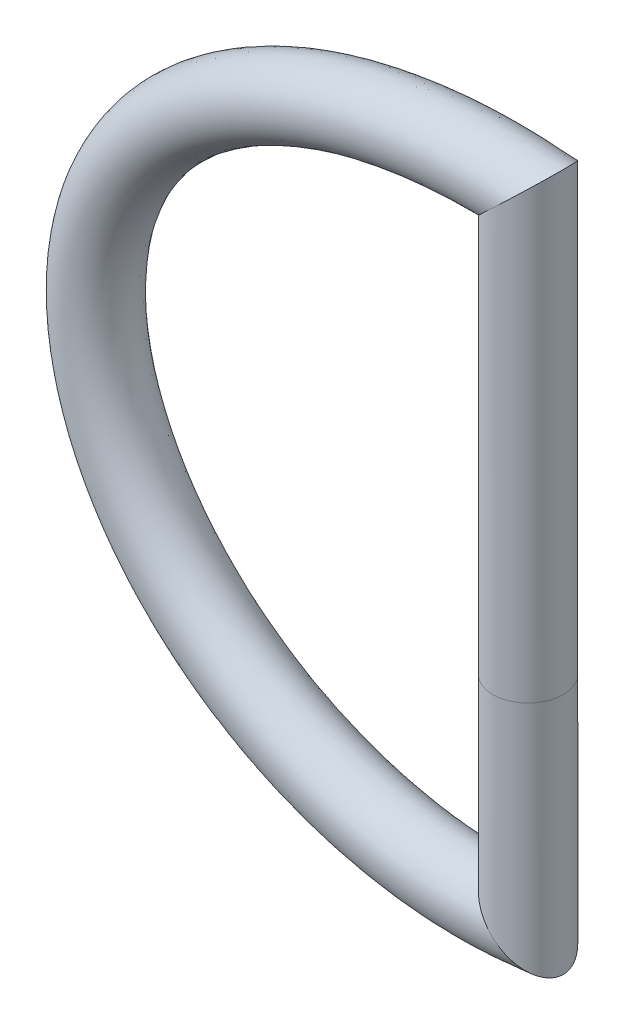
ISO-10303-21;
HEADER;
FILE_DESCRIPTION(('STEP AP214'),'2;1');
FILE_NAME('part.step','',(''),(''),'','','');
FILE_SCHEMA(('AUTOMOTIVE_DESIGN { 1 0 10303 214 1 1 1 1 }'));
ENDSEC;
DATA;
#1=APPLICATION_CONTEXT('core data for automotive mechanical design processes');
#2=APPLICATION_PROTOCOL_DEFINITION('international standard','automotive_design',2000,#1);
#3=PRODUCT_CONTEXT('',#1,'mechanical');
#4=PRODUCT('Part','Part','',(#3));
#5=PRODUCT_RELATED_PRODUCT_CATEGORY('part','',(#4));
#6=PRODUCT_DEFINITION_FORMATION('','',#4);
#7=PRODUCT_DEFINITION_CONTEXT('part definition',#1,'design');
#8=PRODUCT_DEFINITION('design','',#6,#7);
#9=PRODUCT_DEFINITION_SHAPE('','',#8);
#10=(LENGTH_UNIT() NAMED_UNIT(*) SI_UNIT(.MILLI.,.METRE.));
#11=(NAMED_UNIT(*) PLANE_ANGLE_UNIT() SI_UNIT($,.RADIAN.));
#12=(NAMED_UNIT(*) SI_UNIT($,.STERADIAN.) SOLID_ANGLE_UNIT());
#13=UNCERTAINTY_MEASURE_WITH_UNIT(LENGTH_MEASURE(1.E-05),#10,'distance_accuracy_value','');
#14=(GEOMETRIC_REPRESENTATION_CONTEXT(3) GLOBAL_UNCERTAINTY_ASSIGNED_CONTEXT((#13)) GLOBAL_UNIT_ASSIGNED_CONTEXT((#10,
#11,#12)) REPRESENTATION_CONTEXT('',''));
#15=CARTESIAN_POINT('',(0.,0.,0.));
#16=DIRECTION('',(0.,0.,1.));
#17=DIRECTION('',(1.,0.,0.));
#18=AXIS2_PLACEMENT_3D('',#15,#16,#17);
#19=CARTESIAN_POINT('',(0.,0.,0.));
#20=DIRECTION('',(0.,1.,0.));
#21=DIRECTION('',(-1.,0.,0.));
#22=AXIS2_PLACEMENT_3D('',#19,#20,#21);
#23=CYLINDRICAL_SURFACE('',#22,2.5);
#24=CARTESIAN_POINT('',(0.,30.,2.5));
#25=CARTESIAN_POINT('',(-0.00242758933595466,29.997711643465,2.49999999686952));
#26=CARTESIAN_POINT('',(-0.00485516489899741,29.9954231074934,2.49999646103605));
#27=CARTESIAN_POINT('',(-0.196409423319311,29.8148249555442,2.49943868500322));
#28=CARTESIAN_POINT('',(-0.385408715955703,29.6354679999691,2.47744476208934));
#29=CARTESIAN_POINT('',(-0.663935741280289,29.3694003511271,2.41212243911922));
#30=CARTESIAN_POINT('',(-0.756112628902586,29.2810476902248,2.38488054333017));
#31=CARTESIAN_POINT('',(-0.93808848913137,29.1060553229675,2.31933911333307));
#32=CARTESIAN_POINT('',(-1.02788859944775,29.0194148022726,2.28104497805212));
#33=CARTESIAN_POINT('',(-1.24690415816406,28.8074288185577,2.17177219773728));
#34=CARTESIAN_POINT('',(-1.37426751850749,28.6835444220875,2.09393515154554));
#35=CARTESIAN_POINT('',(-1.55707715578674,28.5049401792369,1.95736552682304));
#36=CARTESIAN_POINT('',(-1.61660498614624,28.44664483076,1.90857824252122));
#37=CARTESIAN_POINT('',(-1.73239940853148,28.3330055551281,1.80412556543504));
#38=CARTESIAN_POINT('',(-1.78866672633009,28.2776609713694,1.74846171204557));
#39=CARTESIAN_POINT('',(-1.88259089159773,28.1850913701641,1.64599456905797));
#40=CARTESIAN_POINT('',(-1.92118480021617,28.1469945758922,1.60083133088288));
#41=CARTESIAN_POINT('',(-1.99587040398149,28.0731681772815,1.50668834375601));
#42=CARTESIAN_POINT('',(-2.03196313708981,28.0374375912678,1.45771019609233));
#43=CARTESIAN_POINT('',(-2.10121463224693,27.9687922937819,1.35597804873957));
#44=CARTESIAN_POINT('',(-2.13437755514266,27.9358735912163,1.30322960274689));
#45=CARTESIAN_POINT('',(-2.19740915338584,27.8732330676922,1.19389352681859));
#46=CARTESIAN_POINT('',(-2.22727376255227,27.8435151938274,1.13730129396471));
#47=CARTESIAN_POINT('',(-2.29975950072076,27.7713113233539,0.985771517524161));
#48=CARTESIAN_POINT('',(-2.33944666997743,27.7317008335447,0.887991637828371));
#49=CARTESIAN_POINT('',(-2.40682934743233,27.6643730940401,0.68454266266918));
#50=CARTESIAN_POINT('',(-2.43454321943051,27.6366376318548,0.578885942119706));
#51=CARTESIAN_POINT('',(-2.46576483189486,27.6053734172184,0.416066086068953));
#52=CARTESIAN_POINT('',(-2.4744618373496,27.5966604176581,0.360824831832913));
#53=CARTESIAN_POINT('',(-2.48815561986475,27.582938653416,0.249443945376068));
#54=CARTESIAN_POINT('',(-2.49315431044528,27.577927973144,0.193304793113788));
#55=CARTESIAN_POINT('',(-2.4993369761634,27.5717302109828,0.0806126274247317));
#56=CARTESIAN_POINT('',(-2.50052147494728,27.570542604228,0.0240596718771495));
#57=CARTESIAN_POINT('',(-2.49905762480746,27.5720101180884,-0.0889351343286188));
#58=CARTESIAN_POINT('',(-2.49640916853065,27.5746653463335,-0.145376981830564));
#59=CARTESIAN_POINT('',(-2.48378225921788,27.5873218970721,-0.301371719121013));
#60=CARTESIAN_POINT('',(-2.46970495644719,27.6014304927627,-0.400313065459552));
#61=CARTESIAN_POINT('',(-2.43050917060006,27.6406738229563,-0.593619286574534));
#62=CARTESIAN_POINT('',(-2.40538872757497,27.6658105147363,-0.687983345666535));
#63=CARTESIAN_POINT('',(-2.34413764200287,27.7270156275789,-0.874712940321567));
#64=CARTESIAN_POINT('',(-2.30754222613443,27.7635450721826,-0.966772582173828));
#65=CARTESIAN_POINT('',(-2.22563357530281,27.8451594664577,-1.14280490540782));
#66=CARTESIAN_POINT('',(-2.18031565633525,27.8902490127451,-1.22677320519887));
#67=CARTESIAN_POINT('',(-2.05543394180122,28.0142440877396,-1.43050316792796));
#68=CARTESIAN_POINT('',(-1.97083159672466,28.0980198220673,-1.54423415681154));
#69=CARTESIAN_POINT('',(-1.78945010180347,28.2769574012803,-1.7512600345092));
#70=CARTESIAN_POINT('',(-1.69263905889714,28.3721490350317,-1.84449957666896));
#71=CARTESIAN_POINT('',(-1.45353703630593,28.6063080653121,-2.0418677582088));
#72=CARTESIAN_POINT('',(-1.3075229879158,28.7485926809169,-2.13759578881062));
#73=CARTESIAN_POINT('',(-1.08136147993525,28.9677114679808,-2.2556341255255));
#74=CARTESIAN_POINT('',(-1.00474839388429,29.0417340695137,-2.29073125298253));
#75=CARTESIAN_POINT('',(-0.849601480322741,29.1912155801555,-2.35269275837019));
#76=CARTESIAN_POINT('',(-0.771066974752098,29.2666749941636,-2.37955418335564));
#77=CARTESIAN_POINT('',(-0.467820585401646,29.5571933274376,-2.46686393984059));
#78=CARTESIAN_POINT('',(-0.237520827111306,29.7760648107624,-2.49931892027577));
#79=CARTESIAN_POINT('',(-0.00485513694029879,29.995423135352,-2.49999646169475));
#80=CARTESIAN_POINT('',(-0.00242756126195913,29.9977116714452,-2.49999999748008));
#81=CARTESIAN_POINT('',(0.,29.9999999999962,-2.5));
#82=B_SPLINE_CURVE_WITH_KNOTS('',3,(#24,#25,#26,#27,#28,#29,#30,#31,#32,#33,#34,#35,#36,#37,#38,
#39,#40,#41,#42,#43,#44,#45,#46,#47,#48,#49,#50,#51,#52,#53,#54,#55,#56,#57,#58,#59,#60,#61,#62,
#63,#64,#65,#66,#67,#68,#69,#70,#71,#72,#73,#74,#75,#76,#77,#78,#79,#80,#81),.UNSPECIFIED.,.F.,
.F.,(4,2,2,2,2,2,2,2,2,2,2,2,2,2,2,2,2,2,2,2,2,2,2,2,2,2,2,2,4),(0.,0.010008725858251,
0.789771765318684,1.18108021022694,1.57219782681062,2.15173089651298,2.44112016897403,
2.73044477548927,2.94200076724646,3.15346843313571,3.36463078074316,3.57605061123407,
3.9128117598213,4.24905455828365,4.4186317149882,4.58812107044495,4.75758715589738,
4.92705798783435,5.22833385558132,5.5296632157007,5.84525217694307,6.16101108541662,
6.65219014849806,7.14467999422195,7.81652576527576,8.15274936400428,8.48909337649053,
9.43834641772534,9.44835514358359),.UNSPECIFIED.);
#83=CARTESIAN_POINT('',(0.,29.9999999999962,-2.5));
#84=VERTEX_POINT('',#83);
#85=CARTESIAN_POINT('',(0.,30.,2.5));
#86=VERTEX_POINT('',#85);
#87=EDGE_CURVE('E11',#84,#86,#82,.F.);
#88=ORIENTED_EDGE('',*,*,#87,.F.);
#89=CARTESIAN_POINT('',(0.,30.,2.5));
#90=CARTESIAN_POINT('',(0.00242761921564784,30.0022883858164,2.49999999684379));
#91=CARTESIAN_POINT('',(0.00485529019420946,30.0045768201181,2.49999646096794));
#92=CARTESIAN_POINT('',(0.160398661104378,30.1511991348287,2.49954352397039));
#93=CARTESIAN_POINT('',(0.313694065161512,30.2957012065821,2.48504188368759));
#94=CARTESIAN_POINT('',(0.617683515615141,30.5822535008172,2.42744588777627));
#95=CARTESIAN_POINT('',(0.7683710083105,30.7242975461754,2.38428792631449));
#96=CARTESIAN_POINT('',(1.05742842146146,30.996774684717,2.27044137965047));
#97=CARTESIAN_POINT('',(1.19604966908927,31.1274446853955,2.20100018386744));
#98=CARTESIAN_POINT('',(1.39655669983975,31.3164507108953,2.0750541130404));
#99=CARTESIAN_POINT('',(1.46213681224689,31.3782691701147,2.02945788975828));
#100=CARTESIAN_POINT('',(1.59023746767387,31.4990220168626,1.93072029522012));
#101=CARTESIAN_POINT('',(1.65275874998702,31.5579571012785,1.87758075935365));
#102=CARTESIAN_POINT('',(1.75790395774895,31.6570712178818,1.77862818981656));
#103=CARTESIAN_POINT('',(1.80141766366647,31.6980889931824,1.73459347783126));
#104=CARTESIAN_POINT('',(1.88596734377379,31.7777889339423,1.64226775828615));
#105=CARTESIAN_POINT('',(1.92700434905934,31.816472071354,1.5939785428394));
#106=CARTESIAN_POINT('',(2.00612444689691,31.8910538687954,1.49317190522588));
#107=CARTESIAN_POINT('',(2.04421207950288,31.9269568084632,1.44066124589597));
#108=CARTESIAN_POINT('',(2.11705107585133,31.9956177861256,1.33132161205062));
#109=CARTESIAN_POINT('',(2.15179827200517,32.0283718955829,1.27448739768946));
#110=CARTESIAN_POINT('',(2.23686018839291,32.108554690984,1.12160852181932));
#111=CARTESIAN_POINT('',(2.28416312476724,32.1531443479081,1.02232472506126));
#112=CARTESIAN_POINT('',(2.36624591373553,32.2305188975671,0.814437628427292));
#113=CARTESIAN_POINT('',(2.401045059542,32.2633219768626,0.705849009259704));
#114=CARTESIAN_POINT('',(2.44224346249359,32.3021572542105,0.537444220791034));
#115=CARTESIAN_POINT('',(2.45417208247046,32.3134016528277,0.480111239816979));
#116=CARTESIAN_POINT('',(2.47403219972364,32.3321226008847,0.364165113210484));
#117=CARTESIAN_POINT('',(2.48196576421792,32.3396010989676,0.305552646056614));
#118=CARTESIAN_POINT('',(2.49365865820967,32.3506232927575,0.18756154734911));
#119=CARTESIAN_POINT('',(2.49741929971994,32.3541682252207,0.12818316255167));
#120=CARTESIAN_POINT('',(2.50069241601538,32.3572535967405,0.00921871907608236));
#121=CARTESIAN_POINT('',(2.50020487693854,32.3567940227302,-0.0503673402790819));
#122=CARTESIAN_POINT('',(2.49299705370572,32.3499996376501,-0.214043088529186));
#123=CARTESIAN_POINT('',(2.48185583666801,32.3394974768211,-0.317824292237977));
#124=CARTESIAN_POINT('',(2.44722497054909,32.3068530247535,-0.521319557819026));
#125=CARTESIAN_POINT('',(2.42373430250484,32.2847097729993,-0.621033283348722));
#126=CARTESIAN_POINT('',(2.36537085402751,32.2296940309649,-0.815794622600916));
#127=CARTESIAN_POINT('',(2.33032004122373,32.1966537201866,-0.91074061987044));
#128=CARTESIAN_POINT('',(2.25073490620101,32.1216335599779,-1.09274024847685));
#129=CARTESIAN_POINT('',(2.20619604840121,32.079649435126,-1.17979007672261));
#130=CARTESIAN_POINT('',(2.08622856715247,31.9665632453554,-1.38481022164153));
#131=CARTESIAN_POINT('',(2.00620120577661,31.8911262243177,-1.4977151721705));
#132=CARTESIAN_POINT('',(1.83394605045247,31.7287515638457,-1.70435750374983));
#133=CARTESIAN_POINT('',(1.74168951108571,31.6417868278238,-1.79804835682696));
#134=CARTESIAN_POINT('',(1.51092192976973,31.424255987696,-1.99971495872021));
#135=CARTESIAN_POINT('',(1.36838891695756,31.2898986085347,-2.0990456361338));
#136=CARTESIAN_POINT('',(1.14742324031258,31.0816074608506,-2.22273582255323));
#137=CARTESIAN_POINT('',(1.07251506831104,31.0109960054587,-2.25976641143602));
#138=CARTESIAN_POINT('',(0.920818513164784,30.868000677351,-2.3257129788258));
#139=CARTESIAN_POINT('',(0.844029262212978,30.7956159865796,-2.35462513233609));
#140=CARTESIAN_POINT('',(0.518195357245599,30.4884720501117,-2.45957129343063));
#141=CARTESIAN_POINT('',(0.262037442623841,30.2470085180626,-2.49924733679819));
#142=CARTESIAN_POINT('',(0.00485520742948768,30.0045767420379,-2.49999646329127));
#143=CARTESIAN_POINT('',(0.0024275359641753,30.0022883072752,-2.49999999905308));
#144=CARTESIAN_POINT('',(0.,29.9999999999962,-2.5));
#145=B_SPLINE_CURVE_WITH_KNOTS('',3,(#89,#90,#91,#92,#93,#94,#95,#96,#97,#98,#99,#100,#101,#102,
#103,#104,#105,#106,#107,#108,#109,#110,#111,#112,#113,#114,#115,#116,#117,#118,#119,#120,#121,
#122,#123,#124,#125,#126,#127,#128,#129,#130,#131,#132,#133,#134,#135,#136,#137,#138,#139,#140,
#141,#142,#143,#144),.UNSPECIFIED.,.F.,.F.,(4,2,2,2,2,2,2,2,2,2,2,2,2,2,2,2,2,2,2,2,2,2,2,2,2,2,
2,4),(0.,0.0100087258504155,0.641257400136784,1.27391190455173,1.8796910873187,2.18240370717604,
2.48504279882144,2.70765531304371,2.93017450105917,3.15234405329319,3.37478728571056,
3.72935168819262,4.08336662821073,4.2620319731368,4.44060477348727,4.61912141266644,
4.79763863435357,5.11071292849417,5.42381305869947,5.74197972294347,6.06029882342727,
6.53050545769648,7.00183761698316,7.65671490944865,7.98464339550147,8.31272612663922,
9.3629643819335,9.37297310778393),.UNSPECIFIED.);
#146=EDGE_CURVE('E41',#84,#86,#145,.F.);
#147=ORIENTED_EDGE('',*,*,#146,.T.);
#148=EDGE_LOOP('',(#88,#147));
#149=FACE_BOUND('',#148,.T.);
#150=CARTESIAN_POINT('',(0.,0.,0.));
#151=DIRECTION('',(0.,1.,0.));
#152=DIRECTION('',(0.,0.,1.));
#153=AXIS2_PLACEMENT_3D('',#150,#151,#152);
#154=CIRCLE('',#153,2.5);
#155=CARTESIAN_POINT('',(0.,0.,2.5));
#156=VERTEX_POINT('',#155);
#157=EDGE_CURVE('E36',#156,#156,#154,.T.);
#158=ORIENTED_EDGE('',*,*,#157,.T.);
#159=EDGE_LOOP('',(#158));
#160=FACE_BOUND('',#159,.T.);
#161=ADVANCED_FACE('F33',(#149,#160),#23,.T.);
#162=CARTESIAN_POINT('',(0.,-20.0378907282445,0.));
#163=DIRECTION('',(0.,1.,0.));
#164=DIRECTION('',(-1.,0.,0.));
#165=AXIS2_PLACEMENT_3D('',#162,#163,#164);
#166=CYLINDRICAL_SURFACE('',#165,2.5);
#167=ORIENTED_EDGE('',*,*,#157,.F.);
#168=EDGE_LOOP('',(#167));
#169=FACE_BOUND('',#168,.T.);
#170=CARTESIAN_POINT('',(0.,-15.,2.5));
#171=CARTESIAN_POINT('',(-0.00248748517167338,-14.9977667226863,2.49999999894582));
#172=CARTESIAN_POINT('',(-0.00497490988377203,-14.9955332327376,2.49999628643611));
#173=CARTESIAN_POINT('',(-0.164123975182655,-14.8526142146651,2.49952130417221));
#174=CARTESIAN_POINT('',(-0.320514382726782,-14.7111141928376,2.48433249454209));
#175=CARTESIAN_POINT('',(-0.551962858220917,-14.500141942946,2.43957826909047));
#176=CARTESIAN_POINT('',(-0.628707186653392,-14.4299218815481,2.42095188473309));
#177=CARTESIAN_POINT('',(-0.780753496867249,-14.2902911994343,2.3762786269186));
#178=CARTESIAN_POINT('',(-0.856055575514993,-14.2208805244808,2.35023225369136));
#179=CARTESIAN_POINT('',(-1.07450255628537,-14.0187897060722,2.26263895094367));
#180=CARTESIAN_POINT('',(-1.21519955710655,-13.8876787253153,2.19067844318063));
#181=CARTESIAN_POINT('',(-1.41775886916162,-13.6976824171171,2.06067446218404));
#182=CARTESIAN_POINT('',(-1.48382022363326,-13.6355039382633,2.01370390028028));
#183=CARTESIAN_POINT('',(-1.61267754260394,-13.513837281053,1.91207011168897));
#184=CARTESIAN_POINT('',(-1.67546897680681,-13.4543528492693,1.8573965819424));
#185=CARTESIAN_POINT('',(-1.82413323963542,-13.3130954637082,1.71390833552298));
#186=CARTESIAN_POINT('',(-1.90775744091011,-13.2332634921044,1.62076557174162));
#187=CARTESIAN_POINT('',(-2.06312554707501,-13.0843837016757,1.41766964189256));
#188=CARTESIAN_POINT('',(-2.13489683090265,-13.0153110515917,1.30775637762732));
#189=CARTESIAN_POINT('',(-2.24937242003516,-12.9048117793627,1.096190239651));
#190=CARTESIAN_POINT('',(-2.29501737687687,-12.8606233715634,0.997582278958237));
#191=CARTESIAN_POINT('',(-2.37406927878371,-12.7839581871414,0.791168646996713));
#192=CARTESIAN_POINT('',(-2.40748401702938,-12.7514739527444,0.683368886997056));
#193=CARTESIAN_POINT('',(-2.44678675286235,-12.7132259087219,0.51630175281886));
#194=CARTESIAN_POINT('',(-2.45811117896558,-12.7021967616989,0.45944396412312));
#195=CARTESIAN_POINT('',(-2.4768340640973,-12.6839548816816,0.344493505712135));
#196=CARTESIAN_POINT('',(-2.4842344706924,-12.6767402554722,0.286401463499448));
#197=CARTESIAN_POINT('',(-2.4949374923461,-12.6663041405106,0.169500459236129));
#198=CARTESIAN_POINT('',(-2.49824137491865,-12.6630814166159,0.110691724628808));
#199=CARTESIAN_POINT('',(-2.50068486662611,-12.6606979527666,-0.00707497778342958));
#200=CARTESIAN_POINT('',(-2.49982492777688,-12.6615367718993,-0.0660329286952429));
#201=CARTESIAN_POINT('',(-2.49175173409979,-12.6694110817758,-0.227303379562851));
#202=CARTESIAN_POINT('',(-2.48028999962609,-12.6805902580252,-0.329257119471162));
#203=CARTESIAN_POINT('',(-2.44549152459978,-12.7144889858488,-0.529041420804237));
#204=CARTESIAN_POINT('',(-2.42215316741566,-12.7372101084979,-0.626871418946717));
#205=CARTESIAN_POINT('',(-2.36439046273491,-12.7933439175407,-0.818467593592743));
#206=CARTESIAN_POINT('',(-2.32973230547609,-12.8269819907352,-0.912096004861728));
#207=CARTESIAN_POINT('',(-2.25123667773992,-12.9029919795179,-1.0915814130176));
#208=CARTESIAN_POINT('',(-2.20739460079934,-12.9453682778508,-1.17743447888227));
#209=CARTESIAN_POINT('',(-2.08770767506405,-13.0607424254556,-1.3827313571673));
#210=CARTESIAN_POINT('',(-2.00698959496134,-13.1382907471293,-1.49678686563306));
#211=CARTESIAN_POINT('',(-1.83291927689618,-13.3047206797236,-1.70557167826127));
#212=CARTESIAN_POINT('',(-1.73953207688905,-13.3936336120147,-1.80024561548365));
#213=CARTESIAN_POINT('',(-1.57566566443273,-13.5488413841677,-1.94291626400599));
#214=CARTESIAN_POINT('',(-1.50762902217173,-13.6130736696903,-1.99607381979594));
#215=CARTESIAN_POINT('',(-1.36836735063331,-13.7440811830104,-2.09399279082362));
#216=CARTESIAN_POINT('',(-1.29714799024806,-13.810851860177,-2.13876845076803));
#217=CARTESIAN_POINT('',(-1.07934739107169,-14.0142954166406,-2.26114373058253));
#218=CARTESIAN_POINT('',(-0.928701893404173,-14.1540255736248,-2.32672548710775));
#219=CARTESIAN_POINT('',(-0.650009613721068,-14.410549462476,-2.41759564610391));
#220=CARTESIAN_POINT('',(-0.523019594207043,-14.5267332190513,-2.44813246632711));
#221=CARTESIAN_POINT('',(-0.266587747169477,-14.7598783634521,-2.48912591390831));
#222=CARTESIAN_POINT('',(-0.137148391167591,-14.8768388973974,-2.4996017956938));
#223=CARTESIAN_POINT('',(-0.00497493247137268,-14.9955332110568,-2.49999628670298));
#224=CARTESIAN_POINT('',(-0.00248750796109603,-14.9977667008051,-2.49999999925538));
#225=CARTESIAN_POINT('',(0.,-15.0000000000038,-2.5));
#226=B_SPLINE_CURVE_WITH_KNOTS('',3,(#170,#171,#172,#173,#174,#175,#176,#177,#178,#179,#180,
#181,#182,#183,#184,#185,#186,#187,#188,#189,#190,#191,#192,#193,#194,#195,#196,#197,#198,#199,
#200,#201,#202,#203,#204,#205,#206,#207,#208,#209,#210,#211,#212,#213,#214,#215,#216,#217,#218,
#219,#220,#221,#222,#223,#224,#225),.UNSPECIFIED.,.F.,.F.,(4,2,2,2,2,2,2,2,2,2,2,2,2,2,2,2,2,2,
2,2,2,2,2,2,2,2,2,4),(0.,0.0100290448103385,0.641690574934158,0.958515055333558,
1.27531818157965,1.88854906910156,2.19472854401923,2.50132150551582,2.94514419842587,
3.38792691932566,3.73851885801115,4.08888700653298,4.26570570016507,4.44243655292881,
4.61911270937866,4.79576968665986,5.10377658327082,5.41182541662619,5.72668850417033,
6.04170990027443,6.51849029703365,6.9966142601725,7.31904928934308,7.64093127672657,
8.28507032999133,8.80847340488903,9.33137386683,9.34140291164086),.UNSPECIFIED.);
#227=CARTESIAN_POINT('',(0.,-15.0000000000038,-2.5));
#228=VERTEX_POINT('',#227);
#229=CARTESIAN_POINT('',(0.,-15.,2.5));
#230=VERTEX_POINT('',#229);
#231=EDGE_CURVE('E59',#228,#230,#226,.F.);
#232=ORIENTED_EDGE('',*,*,#231,.T.);
#233=CARTESIAN_POINT('',(0.,-15.,2.5));
#234=CARTESIAN_POINT('',(0.00248750067869611,-15.0022332937215,2.49999999610187));
#235=CARTESIAN_POINT('',(0.00497505681845969,-15.0044666367901,2.4999962836381));
#236=CARTESIAN_POINT('',(0.164208362045282,-15.1474272409919,2.49952120097888));
#237=CARTESIAN_POINT('',(0.321145397448877,-15.2883245005056,2.48432568430823));
#238=CARTESIAN_POINT('',(0.632120512891194,-15.567516820784,2.42396162738511));
#239=CARTESIAN_POINT('',(0.786151122939602,-15.7058051761036,2.37872445926047));
#240=CARTESIAN_POINT('',(1.07645744458139,-15.9664416575493,2.26140747919689));
#241=CARTESIAN_POINT('',(1.21321326228286,-16.0892208160931,2.19149297353111));
#242=CARTESIAN_POINT('',(1.47675096961619,-16.3258245366441,2.02325407352675));
#243=CARTESIAN_POINT('',(1.60354906546643,-16.4396636486013,1.92497711151757));
#244=CARTESIAN_POINT('',(1.76714556028529,-16.5865403046982,1.76946365749541));
#245=CARTESIAN_POINT('',(1.81073784328957,-16.6256773831257,1.72487717769901));
#246=CARTESIAN_POINT('',(1.89532776607489,-16.7016220733735,1.63147168689284));
#247=CARTESIAN_POINT('',(1.93632646827774,-16.7384306390344,1.58265442863631));
#248=CARTESIAN_POINT('',(2.0152457637237,-16.8092842494,1.48085286009788));
#249=CARTESIAN_POINT('',(2.05317085864365,-16.8433333357025,1.42787487631743));
#250=CARTESIAN_POINT('',(2.12556314548871,-16.9083270088073,1.31770013372748));
#251=CARTESIAN_POINT('',(2.16002609154697,-16.9392677836775,1.26049834053085));
#252=CARTESIAN_POINT('',(2.24495165575415,-17.0155138120522,1.10548951366309));
#253=CARTESIAN_POINT('',(2.29217240037809,-17.0579085169745,1.00439836734896));
#254=CARTESIAN_POINT('',(2.37353866335364,-17.1309590107105,0.793138953522669));
#255=CARTESIAN_POINT('',(2.40770289890927,-17.1616316037985,0.682983957127184));
#256=CARTESIAN_POINT('',(2.44759688599231,-17.1974483581492,0.512572148592443));
#257=CARTESIAN_POINT('',(2.45902652763187,-17.2077098711455,0.454651190083287));
#258=CARTESIAN_POINT('',(2.47780169567614,-17.224566185365,0.337641118045447));
#259=CARTESIAN_POINT('',(2.48514945910591,-17.2311629949856,0.278552662774212));
#260=CARTESIAN_POINT('',(2.49560601286078,-17.2405508713193,0.159710877564721));
#261=CARTESIAN_POINT('',(2.49871563040008,-17.2433426807039,0.0999576796690226));
#262=CARTESIAN_POINT('',(2.5006395786748,-17.2450699982217,-0.0196613917809629));
#263=CARTESIAN_POINT('',(2.49945379681729,-17.2440054052692,-0.0795272682477194));
#264=CARTESIAN_POINT('',(2.4902015821421,-17.2356987825303,-0.245218423051646));
#265=CARTESIAN_POINT('',(2.47750762406143,-17.2243021683629,-0.3506379938783));
#266=CARTESIAN_POINT('',(2.43939675652375,-17.1900862957381,-0.557134729456321));
#267=CARTESIAN_POINT('',(2.41397892471566,-17.1672662091954,-0.658211578827823));
#268=CARTESIAN_POINT('',(2.35119539179462,-17.1108992591615,-0.856093228227113));
#269=CARTESIAN_POINT('',(2.31357174350245,-17.0771208111271,-0.952749109930016));
#270=CARTESIAN_POINT('',(2.22842315137688,-17.0006745487197,-1.13777292973215));
#271=CARTESIAN_POINT('',(2.18089329687782,-16.9580023255593,-1.22613672568564));
#272=CARTESIAN_POINT('',(2.05416761887541,-16.8442282251969,-1.43210797849831));
#273=CARTESIAN_POINT('',(1.97041646118581,-16.7690365764182,-1.54467134571903));
#274=CARTESIAN_POINT('',(1.79045917106194,-16.6074712262303,-1.75014501398282));
#275=CARTESIAN_POINT('',(1.69422463646942,-16.5210720254176,-1.84300918527827));
#276=CARTESIAN_POINT('',(1.45735829759881,-16.3084138189177,-2.03895469848759));
#277=CARTESIAN_POINT('',(1.31305121433734,-16.1788551498078,-2.13405861321497));
#278=CARTESIAN_POINT('',(1.08962078847994,-15.9782597155337,-2.25162596023028));
#279=CARTESIAN_POINT('',(1.01393520777945,-15.910309344753,-2.28664701863294));
#280=CARTESIAN_POINT('',(0.860744029803823,-15.7727745144555,-2.3486067782119));
#281=CARTESIAN_POINT('',(0.783237707191828,-15.7031894036996,-2.37554219731698));
#282=CARTESIAN_POINT('',(0.476304030974514,-15.4276252175451,-2.46574903351546));
#283=CARTESIAN_POINT('',(0.241342823803059,-15.2166790227252,-2.49929049862201));
#284=CARTESIAN_POINT('',(0.00497498218090475,-15.004466569724,-2.4999962898896));
#285=CARTESIAN_POINT('',(0.00248742551628022,-15.0022332261847,-2.5000000023199));
#286=CARTESIAN_POINT('',(0.,-15.0000000000038,-2.5));
#287=B_SPLINE_CURVE_WITH_KNOTS('',3,(#233,#234,#235,#236,#237,#238,#239,#240,#241,#242,#243,
#244,#245,#246,#247,#248,#249,#250,#251,#252,#253,#254,#255,#256,#257,#258,#259,#260,#261,#262,
#263,#264,#265,#266,#267,#268,#269,#270,#271,#272,#273,#274,#275,#276,#277,#278,#279,#280,#281,
#282,#283,#284,#285,#286),.UNSPECIFIED.,.F.,.F.,(4,2,2,2,2,2,2,2,2,2,2,2,2,2,2,2,2,2,2,2,2,2,2,
2,2,2,4),(0.,0.0100290447942797,0.641966220754927,1.27535199807839,1.8631695777108,
2.45000975357056,2.67071505670987,2.89132935781481,3.11161447222763,3.33216652122525,
3.68874934144698,4.04481904630948,4.22436540364704,4.40381326540981,4.58322609697454,
4.76264363142203,5.08136711882465,5.40011371377617,5.72609078038924,6.05222982505764,
6.52712120193703,7.003112650224,7.64723548672432,7.96968106599092,8.292257353879,
9.23514212962249,9.24517117441677),.UNSPECIFIED.);
#288=EDGE_CURVE('E56',#228,#230,#287,.F.);
#289=ORIENTED_EDGE('',*,*,#288,.F.);
#290=EDGE_LOOP('',(#232,#289));
#291=FACE_BOUND('',#290,.T.);
#292=ADVANCED_FACE('F58',(#169,#291),#166,.T.);
#293=CARTESIAN_POINT('',(5.2753156711601,29.6882034836044,2.5));
#294=CARTESIAN_POINT('',(4.39609639263621,29.7401695696728,2.5));
#295=CARTESIAN_POINT('',(3.51687711410681,29.7921356557368,2.5));
#296=CARTESIAN_POINT('',(2.19804819631668,29.8700847848349,2.5));
#297=CARTESIAN_POINT('',(1.75843855705327,29.8960678278684,2.5));
#298=CARTESIAN_POINT('',(1.09902409815842,29.9350423924174,2.5));
#299=CARTESIAN_POINT('',(0.879219278526674,29.9480339139342,2.5));
#300=CARTESIAN_POINT('',(0.439609639263369,29.9740169569669,2.5));
#301=CARTESIAN_POINT('',(0.219804432208748,29.9870098434346,2.5));
#302=CARTESIAN_POINT('',(-0.328962875262608,30.0194412788265,2.5));
#303=CARTESIAN_POINT('',(-0.656780502421646,30.0348475300847,2.5));
#304=CARTESIAN_POINT('',(-1.30992110293781,30.0577154283502,2.5));
#305=CARTESIAN_POINT('',(-1.63524465629285,30.0651791180459,2.5));
#306=CARTESIAN_POINT('',(-2.60717405734899,30.0758659706521,2.5));
#307=CARTESIAN_POINT('',(-3.24973864667824,30.0673849166303,2.5));
#308=CARTESIAN_POINT('',(-5.15885923789921,29.9967773793022,2.5));
#309=CARTESIAN_POINT('',(-6.40684206434401,29.8894865198241,2.5));
#310=CARTESIAN_POINT('',(-10.0572327070575,29.4001763683273,2.5));
#311=CARTESIAN_POINT('',(-12.3660827856754,28.8507194663441,2.5));
#312=CARTESIAN_POINT('',(-18.7642800545884,26.6383581070652,2.5));
#313=CARTESIAN_POINT('',(-22.3200648759049,24.4133546772886,2.5));
#314=CARTESIAN_POINT('',(-27.6123672449484,19.1012354870314,2.5));
#315=CARTESIAN_POINT('',(-29.3518252488648,16.0164931049826,2.5));
#316=CARTESIAN_POINT('',(-31.0002019551413,9.63342132490831,2.5));
#317=CARTESIAN_POINT('',(-30.9120607127897,6.33746520816713,2.5));
#318=CARTESIAN_POINT('',(-29.1884904430036,0.114970189427517,2.5));
#319=CARTESIAN_POINT('',(-27.5560014419022,-2.80919545192259,2.5));
#320=CARTESIAN_POINT('',(-23.2332833069244,-7.84184619306227,2.5));
#321=CARTESIAN_POINT('',(-20.5459942107837,-9.94795801986011,2.5));
#322=CARTESIAN_POINT('',(-14.7212917163583,-13.1061985219365,2.5));
#323=CARTESIAN_POINT('',(-11.5868183989907,-14.1559539331969,2.5));
#324=CARTESIAN_POINT('',(-7.02560707104373,-14.9707581181962,2.5));
#325=CARTESIAN_POINT('',(-5.52911618472485,-15.1151023166793,2.5));
#326=CARTESIAN_POINT('',(-3.3745224645741,-15.1779179828739,2.5));
#327=CARTESIAN_POINT('',(-2.67134831120296,-15.1732397820946,2.5));
#328=CARTESIAN_POINT('',(-1.64590684274628,-15.1324455313842,2.5));
#329=CARTESIAN_POINT('',(-1.30897964605329,-15.1132179556712,2.5));
#330=CARTESIAN_POINT('',(-0.811766807924956,-15.0765133778514,2.5));
#331=CARTESIAN_POINT('',(-0.647392187607218,-15.0629679825774,2.5));
#332=CARTESIAN_POINT('',(-0.321510268921067,-15.0333529579569,2.5));
#333=CARTESIAN_POINT('',(-0.160004527933664,-15.017282071309,2.5));
#334=CARTESIAN_POINT('',(0.208700125724048,-14.9774583225766,2.5));
#335=CARTESIAN_POINT('',(0.417396187475442,-14.9549133661263,2.5));
#336=CARTESIAN_POINT('',(0.834792374950951,-14.9098267322525,2.5));
#337=CARTESIAN_POINT('',(1.04349046868875,-14.8872834153157,2.5));
#338=CARTESIAN_POINT('',(1.66958474990202,-14.819653464505,2.5));
#339=CARTESIAN_POINT('',(2.08698093737751,-14.774566830631,2.5));
#340=CARTESIAN_POINT('',(3.33916949980403,-14.6393069290107,2.5));
#341=CARTESIAN_POINT('',(4.17396187475727,-14.5491336612627,2.5));
#342=CARTESIAN_POINT('',(5.00875424970592,-14.4589603935151,2.5));
#343=CARTESIAN_POINT('',(5.57032486773974,34.67949285349,2.5));
#344=CARTESIAN_POINT('',(4.69110558921585,34.7314589395592,2.5));
#345=CARTESIAN_POINT('',(3.81188631068646,34.7834250256216,2.5));
#346=CARTESIAN_POINT('',(2.49305739289632,34.8613741547209,2.5));
#347=CARTESIAN_POINT('',(2.05344775363291,34.8873571977544,2.5));
#348=CARTESIAN_POINT('',(1.39403329473806,34.9263317623029,2.5));
#349=CARTESIAN_POINT('',(1.17422847510632,34.9393232838196,2.5));
#350=CARTESIAN_POINT('',(0.734618835843006,34.9653063268527,2.5));
#351=CARTESIAN_POINT('',(0.528187509734455,34.9775089159769,2.5));
#352=CARTESIAN_POINT('',(-0.0539692456359493,35.0119134205233,2.5));
#353=CARTESIAN_POINT('',(-0.441820968057396,35.0303850200793,2.5));
#354=CARTESIAN_POINT('',(-1.17497290370479,35.056054292302,2.5));
#355=CARTESIAN_POINT('',(-1.54028927975606,35.0644372795033,2.5));
#356=CARTESIAN_POINT('',(-2.63216223658713,35.0764429718233,2.5));
#357=CARTESIAN_POINT('',(-3.35464134201632,35.066923593469,2.5));
#358=CARTESIAN_POINT('',(-5.50343970444256,34.9874517354202,2.5));
#359=CARTESIAN_POINT('',(-6.91110277478021,34.8666127753776,2.5));
#360=CARTESIAN_POINT('',(-11.041536308704,34.3129561242742,2.5));
#361=CARTESIAN_POINT('',(-13.6716823570633,33.6897409881142,2.5));
#362=CARTESIAN_POINT('',(-21.0549919581129,31.1367486098777,2.5));
#363=CARTESIAN_POINT('',(-25.2681162249634,28.5385832629646,2.5));
#364=CARTESIAN_POINT('',(-31.7485855836027,22.033848142964,2.5));
#365=CARTESIAN_POINT('',(-33.9626105284213,18.1588496135821,2.5));
#366=CARTESIAN_POINT('',(-36.0717743165634,9.99145488831442,2.5));
#367=CARTESIAN_POINT('',(-35.9494043293124,5.79260498534372,2.5));
#368=CARTESIAN_POINT('',(-33.7882805048254,-2.00956174060311,2.5));
#369=CARTESIAN_POINT('',(-31.7853762743314,-5.55893664127901,2.5));
#370=CARTESIAN_POINT('',(-26.5897541852936,-11.6078509204803,2.5));
#371=CARTESIAN_POINT('',(-23.4342291320037,-14.0696134579231,2.5));
#372=CARTESIAN_POINT('',(-16.5996141586519,-17.7754435440274,2.5));
#373=CARTESIAN_POINT('',(-12.9794199552959,-18.9863348912583,2.5));
#374=CARTESIAN_POINT('',(-7.6482103348556,-19.9386897516657,2.5));
#375=CARTESIAN_POINT('',(-5.90824963318228,-20.1061734286595,2.5));
#376=CARTESIAN_POINT('',(-3.40352010160898,-20.1791970584447,2.5));
#377=CARTESIAN_POINT('',(-2.58591373042522,-20.1737959935422,2.5));
#378=CARTESIAN_POINT('',(-1.39049393961089,-20.1262396422667,2.5));
#379=CARTESIAN_POINT('',(-0.997179661186374,-20.1038058892086,2.5));
#380=CARTESIAN_POINT('',(-0.415514309131094,-20.0608669713914,2.5));
#381=CARTESIAN_POINT('',(-0.223009729557378,-20.045005485147,2.5));
#382=CARTESIAN_POINT('',(0.159143323517859,-20.0102767339201,2.5));
#383=CARTESIAN_POINT('',(0.362878066082558,-19.989886225871,2.5));
#384=CARTESIAN_POINT('',(0.764045722289874,-19.946556440991,2.5));
#385=CARTESIAN_POINT('',(0.954366554311262,-19.9259960273924,2.5));
#386=CARTESIAN_POINT('',(1.37176274178677,-19.8809093935186,2.5));
#387=CARTESIAN_POINT('',(1.58046083552457,-19.8583660765817,2.5));
#388=CARTESIAN_POINT('',(2.20655511673784,-19.7907361257711,2.5));
#389=CARTESIAN_POINT('',(2.62395130421342,-19.7456494918972,2.5));
#390=CARTESIAN_POINT('',(3.87613986663967,-19.6103895902764,2.5));
#391=CARTESIAN_POINT('',(4.71093224159309,-19.5202163225259,2.5));
#392=CARTESIAN_POINT('',(5.54572461654174,-19.4300430547812,2.5));
#393=CARTESIAN_POINT('',(5.57032486773974,34.67949285349,-2.5));
#394=CARTESIAN_POINT('',(4.69110558921585,34.7314589395592,-2.5));
#395=CARTESIAN_POINT('',(3.81188631068646,34.7834250256216,-2.5));
#396=CARTESIAN_POINT('',(2.49305739289632,34.8613741547209,-2.5));
#397=CARTESIAN_POINT('',(2.05344775363291,34.8873571977544,-2.5));
#398=CARTESIAN_POINT('',(1.39403329473806,34.9263317623029,-2.5));
#399=CARTESIAN_POINT('',(1.17422847510632,34.9393232838196,-2.5));
#400=CARTESIAN_POINT('',(0.734618835843006,34.9653063268527,-2.5));
#401=CARTESIAN_POINT('',(0.528187509734455,34.9775089159769,-2.5));
#402=CARTESIAN_POINT('',(-0.0539692456359493,35.0119134205233,-2.5));
#403=CARTESIAN_POINT('',(-0.441820968057396,35.0303850200793,-2.5));
#404=CARTESIAN_POINT('',(-1.17497290370479,35.056054292302,-2.5));
#405=CARTESIAN_POINT('',(-1.54028927975606,35.0644372795033,-2.5));
#406=CARTESIAN_POINT('',(-2.63216223658713,35.0764429718233,-2.5));
#407=CARTESIAN_POINT('',(-3.35464134201632,35.066923593469,-2.5));
#408=CARTESIAN_POINT('',(-5.50343970444256,34.9874517354202,-2.5));
#409=CARTESIAN_POINT('',(-6.91110277478021,34.8666127753776,-2.5));
#410=CARTESIAN_POINT('',(-11.041536308704,34.3129561242742,-2.5));
#411=CARTESIAN_POINT('',(-13.6716823570633,33.6897409881142,-2.5));
#412=CARTESIAN_POINT('',(-21.0549919581129,31.1367486098777,-2.5));
#413=CARTESIAN_POINT('',(-25.2681162249634,28.5385832629646,-2.5));
#414=CARTESIAN_POINT('',(-31.7485855836027,22.033848142964,-2.5));
#415=CARTESIAN_POINT('',(-33.9626105284213,18.1588496135821,-2.5));
#416=CARTESIAN_POINT('',(-36.0717743165634,9.99145488831442,-2.5));
#417=CARTESIAN_POINT('',(-35.9494043293124,5.79260498534372,-2.5));
#418=CARTESIAN_POINT('',(-33.7882805048254,-2.00956174060311,-2.5));
#419=CARTESIAN_POINT('',(-31.7853762743314,-5.55893664127901,-2.5));
#420=CARTESIAN_POINT('',(-26.5897541852936,-11.6078509204803,-2.5));
#421=CARTESIAN_POINT('',(-23.4342291320037,-14.0696134579231,-2.5));
#422=CARTESIAN_POINT('',(-16.5996141586519,-17.7754435440274,-2.5));
#423=CARTESIAN_POINT('',(-12.9794199552959,-18.9863348912583,-2.5));
#424=CARTESIAN_POINT('',(-7.6482103348556,-19.9386897516657,-2.5));
#425=CARTESIAN_POINT('',(-5.90824963318228,-20.1061734286595,-2.5));
#426=CARTESIAN_POINT('',(-3.40352010160898,-20.1791970584447,-2.5));
#427=CARTESIAN_POINT('',(-2.58591373042522,-20.1737959935422,-2.5));
#428=CARTESIAN_POINT('',(-1.39049393961089,-20.1262396422667,-2.5));
#429=CARTESIAN_POINT('',(-0.997179661186374,-20.1038058892086,-2.5));
#430=CARTESIAN_POINT('',(-0.415514309131094,-20.0608669713914,-2.5));
#431=CARTESIAN_POINT('',(-0.223009729557378,-20.045005485147,-2.5));
#432=CARTESIAN_POINT('',(0.159143323517859,-20.0102767339201,-2.5));
#433=CARTESIAN_POINT('',(0.362878066082558,-19.989886225871,-2.5));
#434=CARTESIAN_POINT('',(0.764045722289874,-19.946556440991,-2.5));
#435=CARTESIAN_POINT('',(0.954366554311262,-19.9259960273924,-2.5));
#436=CARTESIAN_POINT('',(1.37176274178677,-19.8809093935186,-2.5));
#437=CARTESIAN_POINT('',(1.58046083552457,-19.8583660765817,-2.5));
#438=CARTESIAN_POINT('',(2.20655511673784,-19.7907361257711,-2.5));
#439=CARTESIAN_POINT('',(2.62395130421342,-19.7456494918972,-2.5));
#440=CARTESIAN_POINT('',(3.87613986663967,-19.6103895902764,-2.5));
#441=CARTESIAN_POINT('',(4.71093224159309,-19.5202163225259,-2.5));
#442=CARTESIAN_POINT('',(5.54572461654174,-19.4300430547812,-2.5));
#443=CARTESIAN_POINT('',(5.2753156711601,29.6882034836044,-2.5));
#444=CARTESIAN_POINT('',(4.39609639263621,29.7401695696728,-2.5));
#445=CARTESIAN_POINT('',(3.51687711410681,29.7921356557368,-2.5));
#446=CARTESIAN_POINT('',(2.19804819631668,29.8700847848349,-2.5));
#447=CARTESIAN_POINT('',(1.75843855705327,29.8960678278684,-2.5));
#448=CARTESIAN_POINT('',(1.09902409815842,29.9350423924174,-2.5));
#449=CARTESIAN_POINT('',(0.879219278526674,29.9480339139342,-2.5));
#450=CARTESIAN_POINT('',(0.439609639263369,29.9740169569669,-2.5));
#451=CARTESIAN_POINT('',(0.219804432208748,29.9870098434346,-2.5));
#452=CARTESIAN_POINT('',(-0.328962875262608,30.0194412788265,-2.5));
#453=CARTESIAN_POINT('',(-0.656780502421646,30.0348475300847,-2.5));
#454=CARTESIAN_POINT('',(-1.30992110293781,30.0577154283502,-2.5));
#455=CARTESIAN_POINT('',(-1.63524465629285,30.0651791180459,-2.5));
#456=CARTESIAN_POINT('',(-2.60717405734899,30.0758659706521,-2.5));
#457=CARTESIAN_POINT('',(-3.24973864667824,30.0673849166303,-2.5));
#458=CARTESIAN_POINT('',(-5.15885923789921,29.9967773793022,-2.5));
#459=CARTESIAN_POINT('',(-6.40684206434401,29.8894865198241,-2.5));
#460=CARTESIAN_POINT('',(-10.0572327070575,29.4001763683273,-2.5));
#461=CARTESIAN_POINT('',(-12.3660827856754,28.8507194663441,-2.5));
#462=CARTESIAN_POINT('',(-18.7642800545884,26.6383581070652,-2.5));
#463=CARTESIAN_POINT('',(-22.3200648759049,24.4133546772886,-2.5));
#464=CARTESIAN_POINT('',(-27.6123672449484,19.1012354870314,-2.5));
#465=CARTESIAN_POINT('',(-29.3518252488648,16.0164931049826,-2.5));
#466=CARTESIAN_POINT('',(-31.0002019551413,9.63342132490831,-2.5));
#467=CARTESIAN_POINT('',(-30.9120607127897,6.33746520816713,-2.5));
#468=CARTESIAN_POINT('',(-29.1884904430036,0.114970189427517,-2.5));
#469=CARTESIAN_POINT('',(-27.5560014419022,-2.80919545192259,-2.5));
#470=CARTESIAN_POINT('',(-23.2332833069244,-7.84184619306227,-2.5));
#471=CARTESIAN_POINT('',(-20.5459942107837,-9.94795801986011,-2.5));
#472=CARTESIAN_POINT('',(-14.7212917163583,-13.1061985219365,-2.5));
#473=CARTESIAN_POINT('',(-11.5868183989907,-14.1559539331969,-2.5));
#474=CARTESIAN_POINT('',(-7.02560707104373,-14.9707581181962,-2.5));
#475=CARTESIAN_POINT('',(-5.52911618472485,-15.1151023166793,-2.5));
#476=CARTESIAN_POINT('',(-3.3745224645741,-15.1779179828739,-2.5));
#477=CARTESIAN_POINT('',(-2.67134831120296,-15.1732397820946,-2.5));
#478=CARTESIAN_POINT('',(-1.64590684274628,-15.1324455313842,-2.5));
#479=CARTESIAN_POINT('',(-1.30897964605329,-15.1132179556712,-2.5));
#480=CARTESIAN_POINT('',(-0.811766807924956,-15.0765133778514,-2.5));
#481=CARTESIAN_POINT('',(-0.647392187607218,-15.0629679825774,-2.5));
#482=CARTESIAN_POINT('',(-0.321510268921067,-15.0333529579569,-2.5));
#483=CARTESIAN_POINT('',(-0.160004527933664,-15.017282071309,-2.5));
#484=CARTESIAN_POINT('',(0.208700125724048,-14.9774583225766,-2.5));
#485=CARTESIAN_POINT('',(0.417396187475442,-14.9549133661263,-2.5));
#486=CARTESIAN_POINT('',(0.834792374950951,-14.9098267322525,-2.5));
#487=CARTESIAN_POINT('',(1.04349046868875,-14.8872834153157,-2.5));
#488=CARTESIAN_POINT('',(1.66958474990202,-14.819653464505,-2.5));
#489=CARTESIAN_POINT('',(2.08698093737751,-14.774566830631,-2.5));
#490=CARTESIAN_POINT('',(3.33916949980403,-14.6393069290107,-2.5));
#491=CARTESIAN_POINT('',(4.17396187475727,-14.5491336612627,-2.5));
#492=CARTESIAN_POINT('',(5.00875424970592,-14.4589603935151,-2.5));
#493=CARTESIAN_POINT('',(4.98030647458046,24.6969141137187,-2.5));
#494=CARTESIAN_POINT('',(4.10108719605657,24.7488801997864,-2.5));
#495=CARTESIAN_POINT('',(3.22186791752717,24.8008462858519,-2.5));
#496=CARTESIAN_POINT('',(1.90303899973704,24.8787954149489,-2.5));
#497=CARTESIAN_POINT('',(1.46342936047362,24.9047784579824,-2.5));
#498=CARTESIAN_POINT('',(0.804014901578773,24.943753022532,-2.5));
#499=CARTESIAN_POINT('',(0.584210081947024,24.9567445440487,-2.5));
#500=CARTESIAN_POINT('',(0.144600442683731,24.9827275870811,-2.5));
#501=CARTESIAN_POINT('',(-0.0885786453169582,24.9965107708923,-2.5));
#502=CARTESIAN_POINT('',(-0.603956504889267,25.0269691371296,-2.5));
#503=CARTESIAN_POINT('',(-0.871740036785896,25.0393100400902,-2.5));
#504=CARTESIAN_POINT('',(-1.44486930217083,25.0593765643984,-2.5));
#505=CARTESIAN_POINT('',(-1.73020003282965,25.0659209565886,-2.5));
#506=CARTESIAN_POINT('',(-2.58218587811084,25.0752889694809,-2.5));
#507=CARTESIAN_POINT('',(-3.14483595134015,25.0678462397916,-2.5));
#508=CARTESIAN_POINT('',(-4.81427877135585,25.0061030231842,-2.5));
#509=CARTESIAN_POINT('',(-5.9025813539078,24.9123602642706,-2.5));
#510=CARTESIAN_POINT('',(-9.07292910541101,24.4873966123804,-2.5));
#511=CARTESIAN_POINT('',(-11.0604832142875,24.011697944574,-2.5));
#512=CARTESIAN_POINT('',(-16.4735681510639,22.1399676042526,-2.5));
#513=CARTESIAN_POINT('',(-19.3720135268464,20.2881260916125,-2.5));
#514=CARTESIAN_POINT('',(-23.4761489062941,16.1686228310987,-2.5));
#515=CARTESIAN_POINT('',(-24.7410399693083,13.874136596383,-2.5));
#516=CARTESIAN_POINT('',(-25.9286295937193,9.27538776150219,-2.5));
#517=CARTESIAN_POINT('',(-25.874717096267,6.88232543099054,-2.5));
#518=CARTESIAN_POINT('',(-24.5887003811818,2.23950211945814,-2.5));
#519=CARTESIAN_POINT('',(-23.326626609473,-0.0594542625661676,-2.5));
#520=CARTESIAN_POINT('',(-19.8768124285553,-4.07584146564429,-2.5));
#521=CARTESIAN_POINT('',(-17.6577592895637,-5.82630258179713,-2.5));
#522=CARTESIAN_POINT('',(-12.8429692740647,-8.43695349984553,-2.5));
#523=CARTESIAN_POINT('',(-10.1942168426854,-9.32557297513551,-2.5));
#524=CARTESIAN_POINT('',(-6.40300380723187,-10.0028264847267,-2.5));
#525=CARTESIAN_POINT('',(-5.14998273626743,-10.1240312046992,-2.5));
#526=CARTESIAN_POINT('',(-3.34552482753922,-10.1766389073031,-2.5));
#527=CARTESIAN_POINT('',(-2.7567828919807,-10.1726835706471,-2.5));
#528=CARTESIAN_POINT('',(-1.90131974588168,-10.1386514205018,-2.5));
#529=CARTESIAN_POINT('',(-1.62077963092021,-10.1226300221338,-2.5));
#530=CARTESIAN_POINT('',(-1.20801930671882,-10.0921597843115,-2.5));
#531=CARTESIAN_POINT('',(-1.07177464565706,-10.0809304800078,-2.5));
#532=CARTESIAN_POINT('',(-0.802163861359994,-10.0564291819937,-2.5));
#533=CARTESIAN_POINT('',(-0.682887121949886,-10.0446779167471,-2.5));
#534=CARTESIAN_POINT('',(-0.346645470841778,-10.0083602041621,-2.5));
#535=CARTESIAN_POINT('',(-0.119574179360379,-9.98383070486021,-2.5));
#536=CARTESIAN_POINT('',(0.297822008115131,-9.93874407098643,-2.5));
#537=CARTESIAN_POINT('',(0.50652010185293,-9.9162007540496,-2.5));
#538=CARTESIAN_POINT('',(1.13261438306619,-9.84857080323893,-2.5));
#539=CARTESIAN_POINT('',(1.55001057054159,-9.80348416936472,-2.5));
#540=CARTESIAN_POINT('',(2.8021991329684,-9.66822426774502,-2.5));
#541=CARTESIAN_POINT('',(3.63699150792145,-9.57805099999955,-2.5));
#542=CARTESIAN_POINT('',(4.4717838828701,-9.48787773224907,-2.5));
#543=CARTESIAN_POINT('',(4.98030647458046,24.6969141137187,2.5));
#544=CARTESIAN_POINT('',(4.10108719605657,24.7488801997864,2.5));
#545=CARTESIAN_POINT('',(3.22186791752717,24.8008462858519,2.5));
#546=CARTESIAN_POINT('',(1.90303899973704,24.8787954149489,2.5));
#547=CARTESIAN_POINT('',(1.46342936047362,24.9047784579824,2.5));
#548=CARTESIAN_POINT('',(0.804014901578773,24.943753022532,2.5));
#549=CARTESIAN_POINT('',(0.584210081947024,24.9567445440487,2.5));
#550=CARTESIAN_POINT('',(0.144600442683731,24.9827275870811,2.5));
#551=CARTESIAN_POINT('',(-0.0885786453169582,24.9965107708923,2.5));
#552=CARTESIAN_POINT('',(-0.603956504889267,25.0269691371296,2.5));
#553=CARTESIAN_POINT('',(-0.871740036785896,25.0393100400902,2.5));
#554=CARTESIAN_POINT('',(-1.44486930217083,25.0593765643984,2.5));
#555=CARTESIAN_POINT('',(-1.73020003282965,25.0659209565886,2.5));
#556=CARTESIAN_POINT('',(-2.58218587811084,25.0752889694809,2.5));
#557=CARTESIAN_POINT('',(-3.14483595134015,25.0678462397916,2.5));
#558=CARTESIAN_POINT('',(-4.81427877135585,25.0061030231842,2.5));
#559=CARTESIAN_POINT('',(-5.9025813539078,24.9123602642706,2.5));
#560=CARTESIAN_POINT('',(-9.07292910541101,24.4873966123804,2.5));
#561=CARTESIAN_POINT('',(-11.0604832142875,24.011697944574,2.5));
#562=CARTESIAN_POINT('',(-16.4735681510639,22.1399676042526,2.5));
#563=CARTESIAN_POINT('',(-19.3720135268464,20.2881260916125,2.5));
#564=CARTESIAN_POINT('',(-23.4761489062941,16.1686228310987,2.5));
#565=CARTESIAN_POINT('',(-24.7410399693083,13.874136596383,2.5));
#566=CARTESIAN_POINT('',(-25.9286295937193,9.27538776150219,2.5));
#567=CARTESIAN_POINT('',(-25.874717096267,6.88232543099054,2.5));
#568=CARTESIAN_POINT('',(-24.5887003811818,2.23950211945814,2.5));
#569=CARTESIAN_POINT('',(-23.326626609473,-0.0594542625661676,2.5));
#570=CARTESIAN_POINT('',(-19.8768124285553,-4.07584146564429,2.5));
#571=CARTESIAN_POINT('',(-17.6577592895637,-5.82630258179713,2.5));
#572=CARTESIAN_POINT('',(-12.8429692740647,-8.43695349984553,2.5));
#573=CARTESIAN_POINT('',(-10.1942168426854,-9.32557297513551,2.5));
#574=CARTESIAN_POINT('',(-6.40300380723187,-10.0028264847267,2.5));
#575=CARTESIAN_POINT('',(-5.14998273626743,-10.1240312046992,2.5));
#576=CARTESIAN_POINT('',(-3.34552482753922,-10.1766389073031,2.5));
#577=CARTESIAN_POINT('',(-2.7567828919807,-10.1726835706471,2.5));
#578=CARTESIAN_POINT('',(-1.90131974588168,-10.1386514205018,2.5));
#579=CARTESIAN_POINT('',(-1.62077963092021,-10.1226300221338,2.5));
#580=CARTESIAN_POINT('',(-1.20801930671882,-10.0921597843115,2.5));
#581=CARTESIAN_POINT('',(-1.07177464565706,-10.0809304800078,2.5));
#582=CARTESIAN_POINT('',(-0.802163861359994,-10.0564291819937,2.5));
#583=CARTESIAN_POINT('',(-0.682887121949886,-10.0446779167471,2.5));
#584=CARTESIAN_POINT('',(-0.346645470841778,-10.0083602041621,2.5));
#585=CARTESIAN_POINT('',(-0.119574179360379,-9.98383070486021,2.5));
#586=CARTESIAN_POINT('',(0.297822008115131,-9.93874407098643,2.5));
#587=CARTESIAN_POINT('',(0.50652010185293,-9.9162007540496,2.5));
#588=CARTESIAN_POINT('',(1.13261438306619,-9.84857080323893,2.5));
#589=CARTESIAN_POINT('',(1.55001057054159,-9.80348416936472,2.5));
#590=CARTESIAN_POINT('',(2.8021991329684,-9.66822426774502,2.5));
#591=CARTESIAN_POINT('',(3.63699150792145,-9.57805099999955,2.5));
#592=CARTESIAN_POINT('',(4.4717838828701,-9.48787773224907,2.5));
#593=CARTESIAN_POINT('',(5.2753156711601,29.6882034836044,2.5));
#594=CARTESIAN_POINT('',(4.39609639263621,29.7401695696728,2.5));
#595=CARTESIAN_POINT('',(3.51687711410681,29.7921356557368,2.5));
#596=CARTESIAN_POINT('',(2.19804819631668,29.8700847848349,2.5));
#597=CARTESIAN_POINT('',(1.75843855705327,29.8960678278684,2.5));
#598=CARTESIAN_POINT('',(1.09902409815842,29.9350423924174,2.5));
#599=CARTESIAN_POINT('',(0.879219278526674,29.9480339139342,2.5));
#600=CARTESIAN_POINT('',(0.439609639263369,29.9740169569669,2.5));
#601=CARTESIAN_POINT('',(0.219804432208748,29.9870098434346,2.5));
#602=CARTESIAN_POINT('',(-0.328962875262608,30.0194412788265,2.5));
#603=CARTESIAN_POINT('',(-0.656780502421646,30.0348475300847,2.5));
#604=CARTESIAN_POINT('',(-1.30992110293781,30.0577154283502,2.5));
#605=CARTESIAN_POINT('',(-1.63524465629285,30.0651791180459,2.5));
#606=CARTESIAN_POINT('',(-2.60717405734899,30.0758659706521,2.5));
#607=CARTESIAN_POINT('',(-3.24973864667824,30.0673849166303,2.5));
#608=CARTESIAN_POINT('',(-5.15885923789921,29.9967773793022,2.5));
#609=CARTESIAN_POINT('',(-6.40684206434401,29.8894865198241,2.5));
#610=CARTESIAN_POINT('',(-10.0572327070575,29.4001763683273,2.5));
#611=CARTESIAN_POINT('',(-12.3660827856754,28.8507194663441,2.5));
#612=CARTESIAN_POINT('',(-18.7642800545884,26.6383581070652,2.5));
#613=CARTESIAN_POINT('',(-22.3200648759049,24.4133546772886,2.5));
#614=CARTESIAN_POINT('',(-27.6123672449484,19.1012354870314,2.5));
#615=CARTESIAN_POINT('',(-29.3518252488648,16.0164931049826,2.5));
#616=CARTESIAN_POINT('',(-31.0002019551413,9.63342132490831,2.5));
#617=CARTESIAN_POINT('',(-30.9120607127897,6.33746520816713,2.5));
#618=CARTESIAN_POINT('',(-29.1884904430036,0.114970189427517,2.5));
#619=CARTESIAN_POINT('',(-27.5560014419022,-2.80919545192259,2.5));
#620=CARTESIAN_POINT('',(-23.2332833069244,-7.84184619306227,2.5));
#621=CARTESIAN_POINT('',(-20.5459942107837,-9.94795801986011,2.5));
#622=CARTESIAN_POINT('',(-14.7212917163583,-13.1061985219365,2.5));
#623=CARTESIAN_POINT('',(-11.5868183989907,-14.1559539331969,2.5));
#624=CARTESIAN_POINT('',(-7.02560707104373,-14.9707581181962,2.5));
#625=CARTESIAN_POINT('',(-5.52911618472485,-15.1151023166793,2.5));
#626=CARTESIAN_POINT('',(-3.3745224645741,-15.1779179828739,2.5));
#627=CARTESIAN_POINT('',(-2.67134831120296,-15.1732397820946,2.5));
#628=CARTESIAN_POINT('',(-1.64590684274628,-15.1324455313842,2.5));
#629=CARTESIAN_POINT('',(-1.30897964605329,-15.1132179556712,2.5));
#630=CARTESIAN_POINT('',(-0.811766807924956,-15.0765133778514,2.5));
#631=CARTESIAN_POINT('',(-0.647392187607218,-15.0629679825774,2.5));
#632=CARTESIAN_POINT('',(-0.321510268921067,-15.0333529579569,2.5));
#633=CARTESIAN_POINT('',(-0.160004527933664,-15.017282071309,2.5));
#634=CARTESIAN_POINT('',(0.208700125724048,-14.9774583225766,2.5));
#635=CARTESIAN_POINT('',(0.417396187475442,-14.9549133661263,2.5));
#636=CARTESIAN_POINT('',(0.834792374950951,-14.9098267322525,2.5));
#637=CARTESIAN_POINT('',(1.04349046868875,-14.8872834153157,2.5));
#638=CARTESIAN_POINT('',(1.66958474990202,-14.819653464505,2.5));
#639=CARTESIAN_POINT('',(2.08698093737751,-14.774566830631,2.5));
#640=CARTESIAN_POINT('',(3.33916949980403,-14.6393069290107,2.5));
#641=CARTESIAN_POINT('',(4.17396187475727,-14.5491336612627,2.5));
#642=CARTESIAN_POINT('',(5.00875424970592,-14.4589603935151,2.5));
#643=(BOUNDED_SURFACE() B_SPLINE_SURFACE(3,3,((#293,#294,#295,#296,#297,#298,#299,#300,#301,
#302,#303,#304,#305,#306,#307,#308,#309,#310,#311,#312,#313,#314,#315,#316,#317,#318,#319,#320,
#321,#322,#323,#324,#325,#326,#327,#328,#329,#330,#331,#332,#333,#334,#335,#336,#337,#338,#339,
#340,#341,#342),(#343,#344,#345,#346,#347,#348,#349,#350,#351,#352,#353,#354,#355,#356,#357,
#358,#359,#360,#361,#362,#363,#364,#365,#366,#367,#368,#369,#370,#371,#372,#373,#374,#375,#376,
#377,#378,#379,#380,#381,#382,#383,#384,#385,#386,#387,#388,#389,#390,#391,#392),(#393,#394,
#395,#396,#397,#398,#399,#400,#401,#402,#403,#404,#405,#406,#407,#408,#409,#410,#411,#412,#413,
#414,#415,#416,#417,#418,#419,#420,#421,#422,#423,#424,#425,#426,#427,#428,#429,#430,#431,#432,
#433,#434,#435,#436,#437,#438,#439,#440,#441,#442),(#443,#444,#445,#446,#447,#448,#449,#450,
#451,#452,#453,#454,#455,#456,#457,#458,#459,#460,#461,#462,#463,#464,#465,#466,#467,#468,#469,
#470,#471,#472,#473,#474,#475,#476,#477,#478,#479,#480,#481,#482,#483,#484,#485,#486,#487,#488,
#489,#490,#491,#492),(#493,#494,#495,#496,#497,#498,#499,#500,#501,#502,#503,#504,#505,#506,
#507,#508,#509,#510,#511,#512,#513,#514,#515,#516,#517,#518,#519,#520,#521,#522,#523,#524,#525,
#526,#527,#528,#529,#530,#531,#532,#533,#534,#535,#536,#537,#538,#539,#540,#541,#542),(#543,
#544,#545,#546,#547,#548,#549,#550,#551,#552,#553,#554,#555,#556,#557,#558,#559,#560,#561,#562,
#563,#564,#565,#566,#567,#568,#569,#570,#571,#572,#573,#574,#575,#576,#577,#578,#579,#580,#581,
#582,#583,#584,#585,#586,#587,#588,#589,#590,#591,#592),(#593,#594,#595,#596,#597,#598,#599,
#600,#601,#602,#603,#604,#605,#606,#607,#608,#609,#610,#611,#612,#613,#614,#615,#616,#617,#618,
#619,#620,#621,#622,#623,#624,#625,#626,#627,#628,#629,#630,#631,#632,#633,#634,#635,#636,#637,
#638,#639,#640,#641,#642)),.UNSPECIFIED.,.T.,.F.,.F.) B_SPLINE_SURFACE_WITH_KNOTS((4,3,4),(4,2,
2,2,2,2,2,2,2,2,2,2,2,2,2,2,2,2,2,2,2,2,2,2,4),(0.,0.5,1.),(-0.0417608734787446,
-0.0208804367393723,-0.0104402183696862,-0.00522010918484308,0.,0.0078125,0.015625,0.03125,
0.0625,0.125,0.25,0.375,0.5,0.625,0.75,0.875,0.9375,0.96875,0.984375,0.9921875,1.,
1.01019014744942,1.02038029489884,1.04076058979769,1.08152117959538),
.UNSPECIFIED.) GEOMETRIC_REPRESENTATION_ITEM() RATIONAL_B_SPLINE_SURFACE(((1.,1.,1.,1.,1.,1.,1.,
1.,1.,1.,1.,1.,1.,1.,1.,1.,1.,1.,1.,1.,1.,1.,1.,1.,1.,1.,1.,1.,1.,1.,1.,1.,1.,1.,1.,1.,1.,1.,1.,
1.,1.,1.,1.,1.,1.,1.,1.,1.,1.,1.),(0.333333333333333,0.333333333333333,0.333333333333333,
0.333333333333333,0.333333333333333,0.333333333333333,0.333333333333333,0.333333333333333,
0.333333333333333,0.333333333333333,0.333333333333333,0.333333333333333,0.333333333333333,
0.333333333333333,0.333333333333333,0.333333333333333,0.333333333333333,0.333333333333333,
0.333333333333333,0.333333333333333,0.333333333333333,0.333333333333333,0.333333333333333,
0.333333333333333,0.333333333333333,0.333333333333333,0.333333333333333,0.333333333333333,
0.333333333333333,0.333333333333333,0.333333333333333,0.333333333333333,0.333333333333333,
0.333333333333333,0.333333333333333,0.333333333333333,0.333333333333333,0.333333333333333,
0.333333333333333,0.333333333333333,0.333333333333333,0.333333333333333,0.333333333333333,
0.333333333333333,0.333333333333333,0.333333333333333,0.333333333333333,0.333333333333333,
0.333333333333333,0.333333333333333),(0.333333333333333,0.333333333333333,0.333333333333333,
0.333333333333333,0.333333333333333,0.333333333333333,0.333333333333333,0.333333333333333,
0.333333333333333,0.333333333333333,0.333333333333333,0.333333333333333,0.333333333333333,
0.333333333333333,0.333333333333333,0.333333333333333,0.333333333333333,0.333333333333333,
0.333333333333333,0.333333333333333,0.333333333333333,0.333333333333333,0.333333333333333,
0.333333333333333,0.333333333333333,0.333333333333333,0.333333333333333,0.333333333333333,
0.333333333333333,0.333333333333333,0.333333333333333,0.333333333333333,0.333333333333333,
0.333333333333333,0.333333333333333,0.333333333333333,0.333333333333333,0.333333333333333,
0.333333333333333,0.333333333333333,0.333333333333333,0.333333333333333,0.333333333333333,
0.333333333333333,0.333333333333333,0.333333333333333,0.333333333333333,0.333333333333333,
0.333333333333333,0.333333333333333),(1.,1.,1.,1.,1.,1.,1.,1.,1.,1.,1.,1.,1.,1.,1.,1.,1.,1.,1.,
1.,1.,1.,1.,1.,1.,1.,1.,1.,1.,1.,1.,1.,1.,1.,1.,1.,1.,1.,1.,1.,1.,1.,1.,1.,1.,1.,1.,1.,1.,1.),
(0.333333333333333,0.333333333333333,0.333333333333333,0.333333333333333,0.333333333333333,
0.333333333333333,0.333333333333333,0.333333333333333,0.333333333333333,0.333333333333333,
0.333333333333333,0.333333333333333,0.333333333333333,0.333333333333333,0.333333333333333,
0.333333333333333,0.333333333333333,0.333333333333333,0.333333333333333,0.333333333333333,
0.333333333333333,0.333333333333333,0.333333333333333,0.333333333333333,0.333333333333333,
0.333333333333333,0.333333333333333,0.333333333333333,0.333333333333333,0.333333333333333,
0.333333333333333,0.333333333333333,0.333333333333333,0.333333333333333,0.333333333333333,
0.333333333333333,0.333333333333333,0.333333333333333,0.333333333333333,0.333333333333333,
0.333333333333333,0.333333333333333,0.333333333333333,0.333333333333333,0.333333333333333,
0.333333333333333,0.333333333333333,0.333333333333333,0.333333333333333,0.333333333333333),
(0.333333333333333,0.333333333333333,0.333333333333333,0.333333333333333,0.333333333333333,
0.333333333333333,0.333333333333333,0.333333333333333,0.333333333333333,0.333333333333333,
0.333333333333333,0.333333333333333,0.333333333333333,0.333333333333333,0.333333333333333,
0.333333333333333,0.333333333333333,0.333333333333333,0.333333333333333,0.333333333333333,
0.333333333333333,0.333333333333333,0.333333333333333,0.333333333333333,0.333333333333333,
0.333333333333333,0.333333333333333,0.333333333333333,0.333333333333333,0.333333333333333,
0.333333333333333,0.333333333333333,0.333333333333333,0.333333333333333,0.333333333333333,
0.333333333333333,0.333333333333333,0.333333333333333,0.333333333333333,0.333333333333333,
0.333333333333333,0.333333333333333,0.333333333333333,0.333333333333333,0.333333333333333,
0.333333333333333,0.333333333333333,0.333333333333333,0.333333333333333,0.333333333333333),(1.,
1.,1.,1.,1.,1.,1.,1.,1.,1.,1.,1.,1.,1.,1.,1.,1.,1.,1.,1.,1.,1.,1.,1.,1.,1.,1.,1.,1.,1.,1.,1.,1.,
1.,1.,1.,1.,1.,1.,1.,1.,1.,1.,1.,1.,1.,1.,1.,1.,1.))) REPRESENTATION_ITEM('') SURFACE());
#644=ORIENTED_EDGE('',*,*,#87,.T.);
#645=ORIENTED_EDGE('',*,*,#146,.F.);
#646=EDGE_LOOP('',(#644,#645));
#647=FACE_BOUND('',#646,.T.);
#648=ORIENTED_EDGE('',*,*,#231,.F.);
#649=ORIENTED_EDGE('',*,*,#288,.T.);
#650=EDGE_LOOP('',(#648,#649));
#651=FACE_BOUND('',#650,.T.);
#652=ADVANCED_FACE('F62',(#647,#651),#643,.T.);
#653=CLOSED_SHELL('',(#161,#292,#652));
#654=MANIFOLD_SOLID_BREP('B2',#653);
#655=ADVANCED_BREP_SHAPE_REPRESENTATION('',(#18,#654),#14);
#656=SHAPE_DEFINITION_REPRESENTATION(#9,#655);
ENDSEC;
END-ISO-10303-21;
